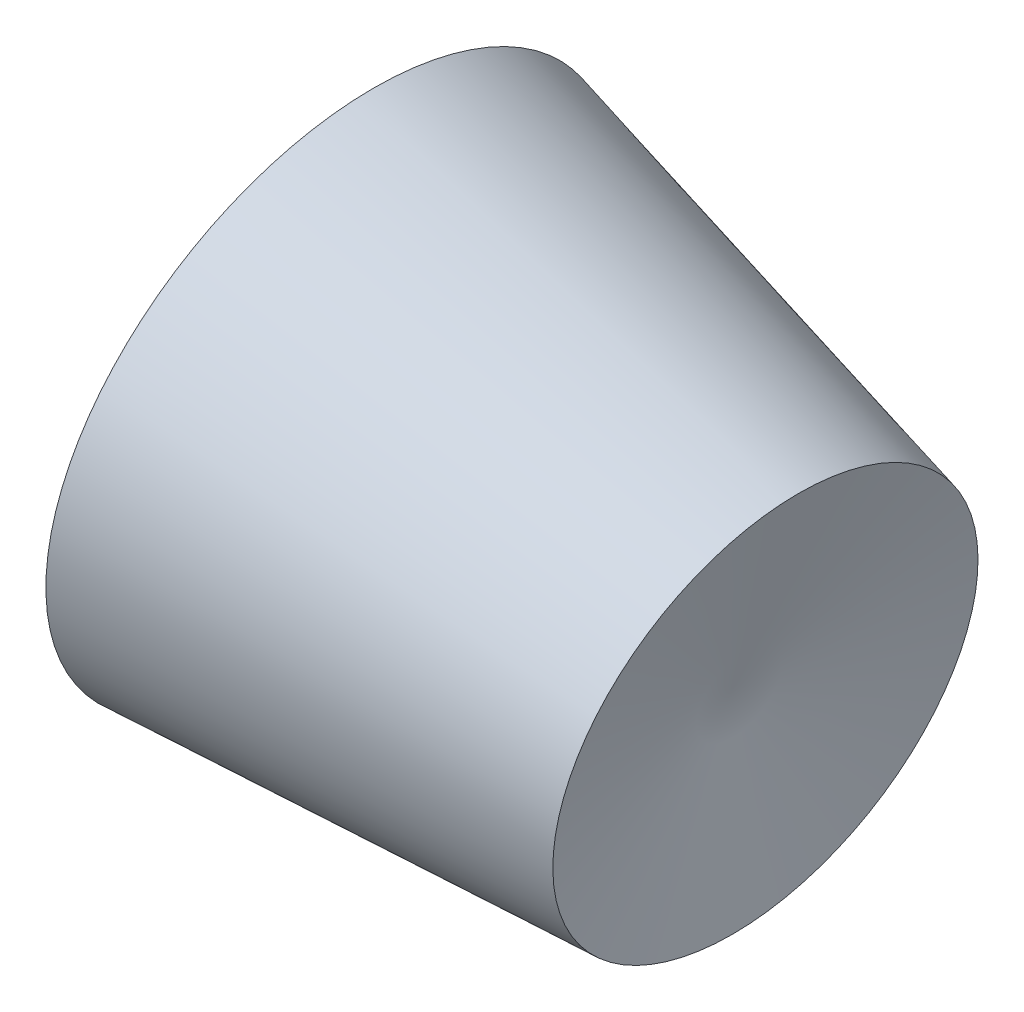
ISO-10303-21;
HEADER;
FILE_DESCRIPTION(('STEP AP214'),'2;1');
FILE_NAME('part.step','',(''),(''),'','','');
FILE_SCHEMA(('AUTOMOTIVE_DESIGN { 1 0 10303 214 1 1 1 1 }'));
ENDSEC;
DATA;
#1=APPLICATION_CONTEXT('core data for automotive mechanical design processes');
#2=APPLICATION_PROTOCOL_DEFINITION('international standard','automotive_design',2000,#1);
#3=PRODUCT_CONTEXT('',#1,'mechanical');
#4=PRODUCT('Part','Part','',(#3));
#5=PRODUCT_RELATED_PRODUCT_CATEGORY('part','',(#4));
#6=PRODUCT_DEFINITION_FORMATION('','',#4);
#7=PRODUCT_DEFINITION_CONTEXT('part definition',#1,'design');
#8=PRODUCT_DEFINITION('design','',#6,#7);
#9=PRODUCT_DEFINITION_SHAPE('','',#8);
#10=(LENGTH_UNIT() NAMED_UNIT(*) SI_UNIT(.MILLI.,.METRE.));
#11=(NAMED_UNIT(*) PLANE_ANGLE_UNIT() SI_UNIT($,.RADIAN.));
#12=(NAMED_UNIT(*) SI_UNIT($,.STERADIAN.) SOLID_ANGLE_UNIT());
#13=UNCERTAINTY_MEASURE_WITH_UNIT(LENGTH_MEASURE(1.E-05),#10,'distance_accuracy_value','');
#14=(GEOMETRIC_REPRESENTATION_CONTEXT(3) GLOBAL_UNCERTAINTY_ASSIGNED_CONTEXT((#13)) GLOBAL_UNIT_ASSIGNED_CONTEXT((#10,
#11,#12)) REPRESENTATION_CONTEXT('',''));
#15=CARTESIAN_POINT('',(0.,0.,0.));
#16=DIRECTION('',(0.,0.,1.));
#17=DIRECTION('',(1.,0.,0.));
#18=AXIS2_PLACEMENT_3D('',#15,#16,#17);
#19=CARTESIAN_POINT('',(-42.4655384461642,88.1910778916554,0.));
#20=DIRECTION('',(-0.987580306335114,0.157115048735132,0.));
#21=DIRECTION('',(-0.157115048735132,-0.987580306335114,0.));
#22=AXIS2_PLACEMENT_3D('',#19,#20,#21);
#23=CONICAL_SURFACE('',#22,116.052821787772,0.157768737595954);
#24=CARTESIAN_POINT('',(138.044090807746,59.4736368739878,0.));
#25=DIRECTION('',(-0.987580306335114,0.157115048735132,0.));
#26=DIRECTION('',(-0.157115048735132,-0.987580306335114,0.));
#27=AXIS2_PLACEMENT_3D('',#24,#25,#26);
#28=CIRCLE('',#27,86.9742336127634);
#29=CARTESIAN_POINT('',(124.379129854976,-26.4204034005668,0.));
#30=VERTEX_POINT('',#29);
#31=EDGE_CURVE('E51',#30,#30,#28,.T.);
#32=ORIENTED_EDGE('',*,*,#31,.T.);
#33=EDGE_LOOP('',(#32));
#34=FACE_BOUND('',#33,.T.);
#35=CARTESIAN_POINT('',(-42.4655384461642,88.1910778916554,0.));
#36=DIRECTION('',(-0.987580306335114,0.157115048735132,0.));
#37=DIRECTION('',(-0.157115048735132,-0.987580306335114,0.));
#38=AXIS2_PLACEMENT_3D('',#35,#36,#37);
#39=CIRCLE('',#38,116.052821787772);
#40=CARTESIAN_POINT('',(-24.2318936951289,202.802559183878,0.));
#41=VERTEX_POINT('',#40);
#42=EDGE_CURVE('E11',#41,#41,#39,.T.);
#43=ORIENTED_EDGE('',*,*,#42,.F.);
#44=EDGE_LOOP('',(#43));
#45=FACE_BOUND('',#44,.T.);
#46=ADVANCED_FACE('F43',(#34,#45),#23,.T.);
#47=CARTESIAN_POINT('',(138.044090807746,59.4736368739878,0.));
#48=DIRECTION('',(0.987580306335114,-0.157115048735132,0.));
#49=DIRECTION('',(0.157115048735132,0.987580306335114,0.));
#50=AXIS2_PLACEMENT_3D('',#47,#48,#49);
#51=CONICAL_SURFACE('',#50,86.9742336127634,1.41302758919894);
#52=CARTESIAN_POINT('',(124.379129854976,61.6476079346558,0.));
#53=VERTEX_POINT('',#52);
#54=VERTEX_LOOP('',#53);
#55=FACE_BOUND('',#54,.T.);
#56=ORIENTED_EDGE('',*,*,#31,.F.);
#57=EDGE_LOOP('',(#56));
#58=FACE_BOUND('',#57,.T.);
#59=ADVANCED_FACE('F57',(#55,#58),#51,.F.);
#60=CARTESIAN_POINT('',(40.9177529588265,74.9255542590432,0.));
#61=DIRECTION('',(-0.987580306335114,0.157115048735132,0.));
#62=DIRECTION('',(-0.157115048735132,-0.987580306335114,0.));
#63=AXIS2_PLACEMENT_3D('',#60,#61,#62);
#64=CONICAL_SURFACE('',#63,0.,0.28769927292393);
#65=CARTESIAN_POINT('',(-56.1304993989343,90.3650489523233,0.));
#66=DIRECTION('',(-0.987580306335114,0.157115048735132,0.));
#67=DIRECTION('',(-0.157115048735132,-0.987580306335114,0.));
#68=AXIS2_PLACEMENT_3D('',#65,#66,#67);
#69=CIRCLE('',#68,29.0785881750085);
#70=CARTESIAN_POINT('',(-51.561815600669,119.082489969991,0.));
#71=VERTEX_POINT('',#70);
#72=EDGE_CURVE('E65',#71,#71,#69,.T.);
#73=ORIENTED_EDGE('',*,*,#72,.T.);
#74=EDGE_LOOP('',(#73));
#75=FACE_BOUND('',#74,.T.);
#76=CARTESIAN_POINT('',(40.9177529588265,74.9255542590432,0.));
#77=VERTEX_POINT('',#76);
#78=VERTEX_LOOP('',#77);
#79=FACE_BOUND('',#78,.T.);
#80=ADVANCED_FACE('F60',(#75,#79),#64,.F.);
#81=CARTESIAN_POINT('',(-56.1304993989343,90.3650489523233,0.));
#82=DIRECTION('',(0.987580306335114,-0.157115048735132,0.));
#83=DIRECTION('',(0.157115048735132,0.987580306335114,0.));
#84=AXIS2_PLACEMENT_3D('',#81,#82,#83);
#85=CONICAL_SURFACE('',#84,29.0785881750085,1.41302758919894);
#86=CARTESIAN_POINT('',(-24.2318936951289,202.802559183878,0.));
#87=CARTESIAN_POINT('',(-24.5165803816449,201.930475129566,0.));
#88=CARTESIAN_POINT('',(-24.801267068161,201.058391075255,0.));
#89=CARTESIAN_POINT('',(-25.370640441193,199.314222966632,0.));
#90=CARTESIAN_POINT('',(-25.6553271277091,198.442138912321,0.));
#91=CARTESIAN_POINT('',(-26.2247005007412,196.697970803698,0.));
#92=CARTESIAN_POINT('',(-26.5093871872572,195.825886749387,0.));
#93=CARTESIAN_POINT('',(-27.0787605602893,194.081718640764,0.));
#94=CARTESIAN_POINT('',(-27.3634472468054,193.209634586453,0.));
#95=CARTESIAN_POINT('',(-27.9328206198374,191.46546647783,0.));
#96=CARTESIAN_POINT('',(-28.2175073063535,190.593382423519,0.));
#97=CARTESIAN_POINT('',(-28.7868806793856,188.849214314896,0.));
#98=CARTESIAN_POINT('',(-29.0715673659016,187.977130260585,0.));
#99=CARTESIAN_POINT('',(-29.6409407389337,186.232962151962,0.));
#100=CARTESIAN_POINT('',(-29.9256274254497,185.360878097651,0.));
#101=CARTESIAN_POINT('',(-30.4950007984818,183.616709989029,0.));
#102=CARTESIAN_POINT('',(-30.7796874849979,182.744625934717,0.));
#103=CARTESIAN_POINT('',(-31.34906085803,181.000457826095,0.));
#104=CARTESIAN_POINT('',(-31.633747544546,180.128373771783,0.));
#105=CARTESIAN_POINT('',(-32.2031209175781,178.384205663161,0.));
#106=CARTESIAN_POINT('',(-32.4878076040941,177.512121608849,0.));
#107=CARTESIAN_POINT('',(-33.0571809771262,175.767953500227,0.));
#108=CARTESIAN_POINT('',(-33.3418676636422,174.895869445915,0.));
#109=CARTESIAN_POINT('',(-33.9112410366743,173.151701337293,0.));
#110=CARTESIAN_POINT('',(-34.1959277231904,172.279617282981,0.));
#111=CARTESIAN_POINT('',(-34.7653010962225,170.535449174359,0.));
#112=CARTESIAN_POINT('',(-35.0499877827385,169.663365120047,0.));
#113=CARTESIAN_POINT('',(-35.6193611557706,167.919197011425,0.));
#114=CARTESIAN_POINT('',(-35.9040478422867,167.047112957113,0.));
#115=CARTESIAN_POINT('',(-36.4734212153187,165.302944848491,0.));
#116=CARTESIAN_POINT('',(-36.7581079018348,164.430860794179,0.));
#117=CARTESIAN_POINT('',(-37.3274812748669,162.686692685557,0.));
#118=CARTESIAN_POINT('',(-37.6121679613829,161.814608631246,0.));
#119=CARTESIAN_POINT('',(-38.181541334415,160.070440522623,0.));
#120=CARTESIAN_POINT('',(-38.466228020931,159.198356468312,0.));
#121=CARTESIAN_POINT('',(-39.0356013939631,157.454188359689,0.));
#122=CARTESIAN_POINT('',(-39.3202880804792,156.582104305378,0.));
#123=CARTESIAN_POINT('',(-39.8896614535112,154.837936196755,0.));
#124=CARTESIAN_POINT('',(-40.1743481400273,153.965852142444,0.));
#125=CARTESIAN_POINT('',(-40.7437215130594,152.221684033821,0.));
#126=CARTESIAN_POINT('',(-41.0284081995754,151.34959997951,0.));
#127=CARTESIAN_POINT('',(-41.5977815726075,149.605431870887,0.));
#128=CARTESIAN_POINT('',(-41.8824682591235,148.733347816576,0.));
#129=CARTESIAN_POINT('',(-42.4518416321556,146.989179707953,0.));
#130=CARTESIAN_POINT('',(-42.7365283186717,146.117095653642,0.));
#131=CARTESIAN_POINT('',(-43.3059016917038,144.372927545019,0.));
#132=CARTESIAN_POINT('',(-43.5905883782198,143.500843490708,0.));
#133=CARTESIAN_POINT('',(-44.1599617512519,141.756675382085,0.));
#134=CARTESIAN_POINT('',(-44.4446484377679,140.884591327774,0.));
#135=CARTESIAN_POINT('',(-45.0140218108,139.140423219151,0.));
#136=CARTESIAN_POINT('',(-45.2987084973161,138.26833916484,0.));
#137=CARTESIAN_POINT('',(-45.8680818703482,136.524171056217,0.));
#138=CARTESIAN_POINT('',(-46.1527685568642,135.652087001906,0.));
#139=CARTESIAN_POINT('',(-46.7221419298963,133.907918893283,0.));
#140=CARTESIAN_POINT('',(-47.0068286164123,133.035834838972,0.));
#141=CARTESIAN_POINT('',(-47.5762019894444,131.291666730349,0.));
#142=CARTESIAN_POINT('',(-47.8608886759605,130.419582676038,0.));
#143=CARTESIAN_POINT('',(-48.4302620489925,128.675414567415,0.));
#144=CARTESIAN_POINT('',(-48.7149487355086,127.803330513104,0.));
#145=CARTESIAN_POINT('',(-49.2843221085407,126.059162404481,0.));
#146=CARTESIAN_POINT('',(-49.5690087950567,125.18707835017,0.));
#147=CARTESIAN_POINT('',(-50.1383821680888,123.442910241547,0.));
#148=CARTESIAN_POINT('',(-50.4230688546048,122.570826187236,0.));
#149=CARTESIAN_POINT('',(-50.9924422276369,120.826658078613,0.));
#150=CARTESIAN_POINT('',(-51.277128914153,119.954574024302,0.));
#151=CARTESIAN_POINT('',(-51.561815600669,119.082489969991,0.));
#152=B_SPLINE_CURVE_WITH_KNOTS('',3,(#86,#87,#88,#89,#90,#91,#92,#93,#94,#95,#96,#97,#98,#99,
#100,#101,#102,#103,#104,#105,#106,#107,#108,#109,#110,#111,#112,#113,#114,#115,#116,#117,#118,
#119,#120,#121,#122,#123,#124,#125,#126,#127,#128,#129,#130,#131,#132,#133,#134,#135,#136,#137,
#138,#139,#140,#141,#142,#143,#144,#145,#146,#147,#148,#149,#150,#151),.UNSPECIFIED.,.F.,.F.,(4,
2,2,2,2,2,2,2,2,2,2,2,2,2,2,2,2,2,2,2,2,2,2,2,2,2,2,2,2,2,2,2,4),(0.,2.75212535422571,
5.50425070845144,8.25637606267712,11.0085014169028,13.7606267711286,16.5127521253543,
19.26487747958,22.0170028338057,24.7691281880314,27.5212535422571,30.2733788964828,
33.0255042507085,35.7776296049342,38.5297549591599,41.2818803133856,44.0340056676113,
46.7861310218371,49.5382563760628,52.2903817302884,55.0425070845141,57.7946324387399,
60.5467577929656,63.2988831471913,66.051008501417,68.8031338556427,71.5552592098684,
74.3073845640941,77.0595099183198,79.8116352725455,82.5637606267712,85.3158859809969,
88.0680113352226),.UNSPECIFIED.);
#153=EDGE_CURVE('BSEAM72',#41,#71,#152,.T.);
#154=ORIENTED_EDGE('',*,*,#42,.T.);
#155=ORIENTED_EDGE('',*,*,#72,.F.);
#156=ORIENTED_EDGE('',*,*,#153,.T.);
#157=ORIENTED_EDGE('',*,*,#153,.F.);
#158=EDGE_LOOP('',(#154,#156,#155,#157));
#159=FACE_BOUND('',#158,.T.);
#160=ADVANCED_FACE('F72',(#159),#85,.T.);
#161=CLOSED_SHELL('',(#46,#59,#80,#160));
#162=MANIFOLD_SOLID_BREP('B2',#161);
#163=ADVANCED_BREP_SHAPE_REPRESENTATION('',(#18,#162),#14);
#164=SHAPE_DEFINITION_REPRESENTATION(#9,#163);
ENDSEC;
END-ISO-10303-21;
